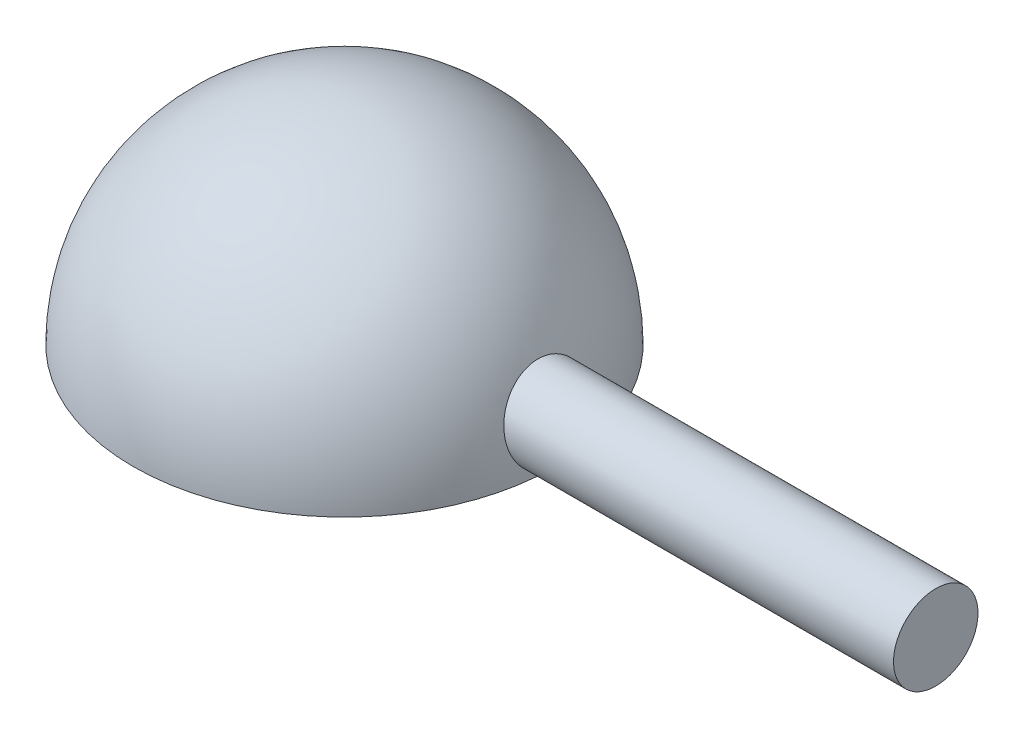
ISO-10303-21;
HEADER;
FILE_DESCRIPTION(('STEP AP214'),'2;1');
FILE_NAME('part.step','',(''),(''),'','','');
FILE_SCHEMA(('AUTOMOTIVE_DESIGN { 1 0 10303 214 1 1 1 1 }'));
ENDSEC;
DATA;
#1=APPLICATION_CONTEXT('core data for automotive mechanical design processes');
#2=APPLICATION_PROTOCOL_DEFINITION('international standard','automotive_design',2000,#1);
#3=PRODUCT_CONTEXT('',#1,'mechanical');
#4=PRODUCT('Part','Part','',(#3));
#5=PRODUCT_RELATED_PRODUCT_CATEGORY('part','',(#4));
#6=PRODUCT_DEFINITION_FORMATION('','',#4);
#7=PRODUCT_DEFINITION_CONTEXT('part definition',#1,'design');
#8=PRODUCT_DEFINITION('design','',#6,#7);
#9=PRODUCT_DEFINITION_SHAPE('','',#8);
#10=(LENGTH_UNIT() NAMED_UNIT(*) SI_UNIT(.MILLI.,.METRE.));
#11=(NAMED_UNIT(*) PLANE_ANGLE_UNIT() SI_UNIT($,.RADIAN.));
#12=(NAMED_UNIT(*) SI_UNIT($,.STERADIAN.) SOLID_ANGLE_UNIT());
#13=UNCERTAINTY_MEASURE_WITH_UNIT(LENGTH_MEASURE(1.E-05),#10,'distance_accuracy_value','');
#14=(GEOMETRIC_REPRESENTATION_CONTEXT(3) GLOBAL_UNCERTAINTY_ASSIGNED_CONTEXT((#13)) GLOBAL_UNIT_ASSIGNED_CONTEXT((#10,
#11,#12)) REPRESENTATION_CONTEXT('',''));
#15=CARTESIAN_POINT('',(0.,0.,0.));
#16=DIRECTION('',(0.,0.,1.));
#17=DIRECTION('',(1.,0.,0.));
#18=AXIS2_PLACEMENT_3D('',#15,#16,#17);
#19=CARTESIAN_POINT('',(0.,0.,0.));
#20=DIRECTION('',(0.,-1.,0.));
#21=DIRECTION('',(-1.,0.,0.));
#22=AXIS2_PLACEMENT_3D('',#19,#20,#21);
#23=SPHERICAL_SURFACE('',#22,22.);
#24=CARTESIAN_POINT('',(0.,0.,0.));
#25=DIRECTION('',(0.,-1.,0.));
#26=DIRECTION('',(1.,0.,0.));
#27=AXIS2_PLACEMENT_3D('',#24,#25,#26);
#28=CIRCLE('',#27,22.);
#29=CARTESIAN_POINT('',(22.,0.,0.));
#30=VERTEX_POINT('',#29);
#31=EDGE_CURVE('E38',#30,#30,#28,.T.);
#32=ORIENTED_EDGE('',*,*,#31,.T.);
#33=EDGE_LOOP('',(#32));
#34=FACE_BOUND('',#33,.T.);
#35=ADVANCED_FACE('F32',(#34),#23,.F.);
#36=CARTESIAN_POINT('',(0.,0.,0.));
#37=DIRECTION('',(0.,-1.,0.));
#38=DIRECTION('',(-1.,0.,0.));
#39=AXIS2_PLACEMENT_3D('',#36,#37,#38);
#40=SPHERICAL_SURFACE('',#39,25.);
#41=CARTESIAN_POINT('',(0.,0.,0.));
#42=DIRECTION('',(0.,-1.,0.));
#43=DIRECTION('',(1.,0.,0.));
#44=AXIS2_PLACEMENT_3D('',#41,#42,#43);
#45=CIRCLE('',#44,25.);
#46=CARTESIAN_POINT('',(25.,0.,0.));
#47=VERTEX_POINT('',#46);
#48=EDGE_CURVE('E11',#47,#47,#45,.T.);
#49=ORIENTED_EDGE('',*,*,#48,.F.);
#50=CARTESIAN_POINT('',(24.6796734428658,1.59137187534987,-3.6580396810126));
#51=CARTESIAN_POINT('',(24.6585359022869,1.69570539470935,-3.75526030952915));
#52=CARTESIAN_POINT('',(24.6365482559279,1.80410083084184,-3.8479208362784));
#53=CARTESIAN_POINT('',(24.59101745711,2.02823786768839,-4.02354370793574));
#54=CARTESIAN_POINT('',(24.5674738157008,2.14398177710607,-4.10650298145985));
#55=CARTESIAN_POINT('',(24.5189759557165,2.38204066482584,-4.26222271129832));
#56=CARTESIAN_POINT('',(24.4940202259322,2.50436267575854,-4.33497193972041));
#57=CARTESIAN_POINT('',(24.4428843284417,2.75460595616633,-4.46972121618427));
#58=CARTESIAN_POINT('',(24.4167037041784,2.88252931228348,-4.53171721496772));
#59=CARTESIAN_POINT('',(24.3633490782356,3.14279321506603,-4.64444423952012));
#60=CARTESIAN_POINT('',(24.3361767341565,3.27512636148128,-4.69519314259956));
#61=CARTESIAN_POINT('',(24.2809734408312,3.54350908176631,-4.78525619062332));
#62=CARTESIAN_POINT('',(24.2529421800017,3.67956000232401,-4.82456613032864));
#63=CARTESIAN_POINT('',(24.1962384118563,3.95428499657675,-4.89146755214071));
#64=CARTESIAN_POINT('',(24.1675663276691,4.09295733056587,-4.91906653948653));
#65=CARTESIAN_POINT('',(24.1097464064086,4.37209642833846,-4.96242828872197));
#66=CARTESIAN_POINT('',(24.0805983963834,4.51256384023461,-4.97818664529502));
#67=CARTESIAN_POINT('',(24.0216981034913,4.79588973721853,-4.99787300572693));
#68=CARTESIAN_POINT('',(23.9919427244448,4.9387571667149,-5.00166322492772));
#69=CARTESIAN_POINT('',(23.9323541827881,5.22433113076748,-4.99700679714209));
#70=CARTESIAN_POINT('',(23.902520995383,5.36703758581078,-4.98855560258372));
#71=CARTESIAN_POINT('',(23.8430059743239,5.65119514055027,-4.95946943340026));
#72=CARTESIAN_POINT('',(23.813324102118,5.79264656758131,-4.93883773651994));
#73=CARTESIAN_POINT('',(23.7543047630852,6.07338763964347,-4.8855154910744));
#74=CARTESIAN_POINT('',(23.7249674274663,6.21267646721747,-4.85282049294813));
#75=CARTESIAN_POINT('',(23.6667282436072,6.4886826046736,-4.7754015433584));
#76=CARTESIAN_POINT('',(23.6378290054006,6.62538521462825,-4.73062318328802));
#77=CARTESIAN_POINT('',(23.5808108901128,6.89461710638795,-4.62937594415187));
#78=CARTESIAN_POINT('',(23.5526923084875,7.02714481060053,-4.57290270551263));
#79=CARTESIAN_POINT('',(23.4974710711255,7.28696149105225,-4.44865407976935));
#80=CARTESIAN_POINT('',(23.4703680293239,7.41425245991425,-4.38088304210721));
#81=CARTESIAN_POINT('',(23.4173783354278,7.66270958201353,-4.23447861317797));
#82=CARTESIAN_POINT('',(23.3914921310614,7.78387348205543,-4.15584126499921));
#83=CARTESIAN_POINT('',(23.3164529772395,8.13454967832353,-3.90592962622759));
#84=CARTESIAN_POINT('',(23.269353764038,8.3539056300843,-3.71938109126199));
#85=CARTESIAN_POINT('',(23.1823750608564,8.7579388356968,-3.31067355102553));
#86=CARTESIAN_POINT('',(23.1424947877226,8.94261985137422,-3.08851841350818));
#87=CARTESIAN_POINT('',(23.072029018999,9.26826963379942,-2.6194872303452));
#88=CARTESIAN_POINT('',(23.0412745750369,9.41003407864025,-2.37319012824175));
#89=CARTESIAN_POINT('',(22.9891251751572,9.65008087178817,-1.85934068534083));
#90=CARTESIAN_POINT('',(22.9677289776113,9.748368988443,-1.59179116982848));
#91=CARTESIAN_POINT('',(22.9354420583853,9.89657545532486,-1.04924726284828));
#92=CARTESIAN_POINT('',(22.9243344651131,9.94749244011322,-0.774538381528851));
#93=CARTESIAN_POINT('',(22.9122458907854,10.0029026327072,-0.220267075664374));
#94=CARTESIAN_POINT('',(22.9112639980954,10.0074000197501,0.059294909677169));
#95=CARTESIAN_POINT('',(22.9194090976428,9.97007016171436,0.611600598392877));
#96=CARTESIAN_POINT('',(22.928408909495,9.92882572949091,0.884385829657576));
#97=CARTESIAN_POINT('',(22.9559890962843,9.80227526025605,1.41901893880074));
#98=CARTESIAN_POINT('',(22.9745694116169,9.71696949736939,1.68086688471387));
#99=CARTESIAN_POINT('',(23.0207170663831,9.50471159222035,2.18702639235164));
#100=CARTESIAN_POINT('',(23.0483073576434,9.37765308464062,2.43129120302834));
#101=CARTESIAN_POINT('',(23.1115247343401,9.08584198281053,2.8949881029711));
#102=CARTESIAN_POINT('',(23.147152378585,8.92108676763124,3.11441846399275));
#103=CARTESIAN_POINT('',(23.2259266816726,8.55579016885428,3.52608833836941));
#104=CARTESIAN_POINT('',(23.2691854978319,8.35471372572423,3.71783139176301));
#105=CARTESIAN_POINT('',(23.3614516722535,7.92447013403299,4.06496052762873));
#106=CARTESIAN_POINT('',(23.4104596631729,7.69529989381776,4.22034260318059));
#107=CARTESIAN_POINT('',(23.5138876751142,7.20998150427177,4.4939129773407));
#108=CARTESIAN_POINT('',(23.5684026732814,6.95335266682937,4.61121276971353));
#109=CARTESIAN_POINT('',(23.6803085951158,6.42461151066,4.8009792183356));
#110=CARTESIAN_POINT('',(23.737699816791,6.15249758711299,4.87344121847944));
#111=CARTESIAN_POINT('',(23.8547715771786,5.59533579302961,4.97262920107424));
#112=CARTESIAN_POINT('',(23.9144746562939,5.31014424749125,4.99852303176356));
#113=CARTESIAN_POINT('',(24.0335029121741,4.73942811123739,5.00135409658265));
#114=CARTESIAN_POINT('',(24.0928280683655,4.45390350337478,4.97828868790588));
#115=CARTESIAN_POINT('',(24.2098083199741,3.88886240031468,4.88343418668524));
#116=CARTESIAN_POINT('',(24.2674512814798,3.60939214491838,4.81135403318416));
#117=CARTESIAN_POINT('',(24.3790851869212,3.06633234157213,4.61993391235392));
#118=CARTESIAN_POINT('',(24.4330762179201,2.80274241504729,4.5005950721497));
#119=CARTESIAN_POINT('',(24.5354806426946,2.30127953884273,4.21888903786277));
#120=CARTESIAN_POINT('',(24.5839341081296,2.06322271381997,4.05686331274547));
#121=CARTESIAN_POINT('',(24.6743967030997,1.61761957765928,3.69350738041223));
#122=CARTESIAN_POINT('',(24.7164064016221,1.41007057273649,3.4921806470626));
#123=CARTESIAN_POINT('',(24.7732918483269,1.12843641213792,3.16720392872321));
#124=CARTESIAN_POINT('',(24.7911068976423,1.04013024510118,3.0560783375387));
#125=CARTESIAN_POINT('',(24.8247585667724,0.873164465914474,2.82653992302827));
#126=CARTESIAN_POINT('',(24.840595978936,0.7945009906112,2.70813004674967));
#127=CARTESIAN_POINT('',(24.8701820084345,0.647426611044832,2.46481851606739));
#128=CARTESIAN_POINT('',(24.883929990288,0.579018826042565,2.33991490209189));
#129=CARTESIAN_POINT('',(24.9092275700743,0.453054182571095,2.08459472992838));
#130=CARTESIAN_POINT('',(24.9207780407636,0.395493016379956,1.95418038561982));
#131=CARTESIAN_POINT('',(24.9414021291718,0.2926564204935,1.69128891344144));
#132=CARTESIAN_POINT('',(24.9505187949801,0.247167560431447,1.55889860183116));
#133=CARTESIAN_POINT('',(24.9664914724319,0.167436737858227,1.29069597378882));
#134=CARTESIAN_POINT('',(24.9733483771803,0.133190332114425,1.15488503216027));
#135=CARTESIAN_POINT('',(24.9847580117169,0.0761899696683871,0.880739178347056));
#136=CARTESIAN_POINT('',(24.9893101265201,0.0534390803068291,0.742403602707511));
#137=CARTESIAN_POINT('',(24.9960728416782,0.0196353959747366,0.464306656515208));
#138=CARTESIAN_POINT('',(24.9982843366962,0.00857813131087018,0.324545851371787));
#139=CARTESIAN_POINT('',(25.0003392665488,-0.00169624222136513,0.0463904125360264));
#140=CARTESIAN_POINT('',(25.000213060132,-0.00106514298511175,-0.0919984130554388));
#141=CARTESIAN_POINT('',(24.9976681796021,0.0116587199846711,-0.368174727214792));
#142=CARTESIAN_POINT('',(24.995250373813,0.0237471423527735,-0.505962423694326));
#143=CARTESIAN_POINT('',(24.988138679522,0.0592937961931272,-0.78008694563061));
#144=CARTESIAN_POINT('',(24.9834434373846,0.0827587895322483,-0.916422858880952));
#145=CARTESIAN_POINT('',(24.9718118499474,0.14086466947592,-1.1865421268396));
#146=CARTESIAN_POINT('',(24.9648763170041,0.175501505028682,-1.32032638821309));
#147=CARTESIAN_POINT('',(24.9488211029677,0.255638988356832,-1.58431261918408));
#148=CARTESIAN_POINT('',(24.9397037027735,0.301128290936354,-1.71451817249418));
#149=CARTESIAN_POINT('',(24.9193485511259,0.402617126329387,-1.97053959299298));
#150=CARTESIAN_POINT('',(24.9081115572957,0.458612903692103,-2.09635700968658));
#151=CARTESIAN_POINT('',(24.8836037544865,0.580641411844228,-2.34267856076481));
#152=CARTESIAN_POINT('',(24.870334782617,0.646665075992362,-2.46318736918332));
#153=CARTESIAN_POINT('',(24.841851411233,0.788262115492275,-2.69816204586077));
#154=CARTESIAN_POINT('',(24.8266375301829,0.8638329457438,-2.81262951314327));
#155=CARTESIAN_POINT('',(24.7912035010841,1.03966012119389,-3.05655187764245));
#156=CARTESIAN_POINT('',(24.7705861989648,1.14185366976036,-3.18455891447051));
#157=CARTESIAN_POINT('',(24.7269076609839,1.35805141495025,-3.42971173781286));
#158=CARTESIAN_POINT('',(24.703846450342,1.47205548969554,-3.54685763638447));
#159=CARTESIAN_POINT('',(24.6796734428658,1.59137187534987,-3.6580396810126));
#160=B_SPLINE_CURVE_WITH_KNOTS('',3,(#50,#51,#52,#53,#54,#55,#56,#57,#58,#59,#60,#61,#62,#63,
#64,#65,#66,#67,#68,#69,#70,#71,#72,#73,#74,#75,#76,#77,#78,#79,#80,#81,#82,#83,#84,#85,#86,#87,
#88,#89,#90,#91,#92,#93,#94,#95,#96,#97,#98,#99,#100,#101,#102,#103,#104,#105,#106,#107,#108,
#109,#110,#111,#112,#113,#114,#115,#116,#117,#118,#119,#120,#121,#122,#123,#124,#125,#126,#127,
#128,#129,#130,#131,#132,#133,#134,#135,#136,#137,#138,#139,#140,#141,#142,#143,#144,#145,#146,
#147,#148,#149,#150,#151,#152,#153,#154,#155,#156,#157,#158,#159),.UNSPECIFIED.,.T.,.F.,(4,2,2,
2,2,2,2,2,2,2,2,2,2,2,2,2,2,2,2,2,2,2,2,2,2,2,2,2,2,2,2,2,2,2,2,2,2,2,2,2,2,2,2,2,2,2,2,2,2,2,2,
2,2,2,4),(0.,0.432352265314396,0.864841043418093,1.29780176002113,1.73092516091135,
2.16335509222007,2.5959437949524,3.02825484279049,3.4607266527825,3.89815952912731,
4.33575494942091,4.77323266744708,5.21087191115731,5.65051561065925,6.09032349488061,
6.5299624506372,6.96976192264718,7.8404693700369,8.71108230118473,9.56439541394444,
10.4175952769321,11.2523717288091,12.087073023653,12.9112600355143,13.7354419198104,
14.5617399026684,15.3880953527926,16.2277987431268,17.0675946238708,17.9257713402073,
18.7840371575179,19.657492904973,20.5309958025328,21.4097315896979,22.2884464201789,
23.1603349320243,24.0321464113984,24.4608784553188,24.8894381709467,25.318127969412,
25.7466471537352,26.1669913196755,26.5871691570098,27.0074590509771,27.4275882380027,
27.8422652534739,28.2567852038946,28.6715518342074,29.0861682336417,29.5003530768498,
29.9143901542442,30.328055087279,30.7416099765724,31.23605550321,31.7304959279505),.UNSPECIFIED.);
#161=EDGE_CURVE('E42',#47,#47,#160,.T.);
#162=ORIENTED_EDGE('',*,*,#161,.F.);
#163=EDGE_LOOP('',(#49,#162));
#164=FACE_BOUND('',#163,.T.);
#165=ADVANCED_FACE('F63',(#164),#40,.T.);
#166=CARTESIAN_POINT('',(-25.,0.,0.));
#167=DIRECTION('',(0.,1.,0.));
#168=DIRECTION('',(-1.,0.,0.));
#169=AXIS2_PLACEMENT_3D('',#166,#167,#168);
#170=PLANE('',#169);
#171=ORIENTED_EDGE('',*,*,#31,.F.);
#172=EDGE_LOOP('',(#171));
#173=FACE_BOUND('',#172,.T.);
#174=ORIENTED_EDGE('',*,*,#48,.T.);
#175=EDGE_LOOP('',(#174));
#176=FACE_BOUND('',#175,.T.);
#177=ADVANCED_FACE('F61',(#173,#176),#170,.F.);
#178=CARTESIAN_POINT('',(-25.002,5.,0.));
#179=DIRECTION('',(1.,0.,0.));
#180=DIRECTION('',(0.,0.,-1.));
#181=AXIS2_PLACEMENT_3D('',#178,#179,#180);
#182=CYLINDRICAL_SURFACE('',#181,5.);
#183=ORIENTED_EDGE('',*,*,#161,.T.);
#184=EDGE_LOOP('',(#183));
#185=FACE_BOUND('',#184,.T.);
#186=CARTESIAN_POINT('',(70.,5.,0.));
#187=DIRECTION('',(1.,0.,0.));
#188=DIRECTION('',(0.,0.,-1.));
#189=AXIS2_PLACEMENT_3D('',#186,#187,#188);
#190=CIRCLE('',#189,5.);
#191=CARTESIAN_POINT('',(70.,5.,-5.));
#192=VERTEX_POINT('',#191);
#193=EDGE_CURVE('E47',#192,#192,#190,.T.);
#194=ORIENTED_EDGE('',*,*,#193,.F.);
#195=EDGE_LOOP('',(#194));
#196=FACE_BOUND('',#195,.T.);
#197=ADVANCED_FACE('F43',(#185,#196),#182,.T.);
#198=CARTESIAN_POINT('',(70.,5.,0.));
#199=DIRECTION('',(1.,0.,0.));
#200=DIRECTION('',(0.,0.,-1.));
#201=AXIS2_PLACEMENT_3D('',#198,#199,#200);
#202=PLANE('',#201);
#203=ORIENTED_EDGE('',*,*,#193,.T.);
#204=EDGE_LOOP('',(#203));
#205=FACE_BOUND('',#204,.T.);
#206=ADVANCED_FACE('F93',(#205),#202,.T.);
#207=CLOSED_SHELL('',(#35,#165,#177,#197,#206));
#208=MANIFOLD_SOLID_BREP('B2',#207);
#209=ADVANCED_BREP_SHAPE_REPRESENTATION('',(#18,#208),#14);
#210=SHAPE_DEFINITION_REPRESENTATION(#9,#209);
ENDSEC;
END-ISO-10303-21;
